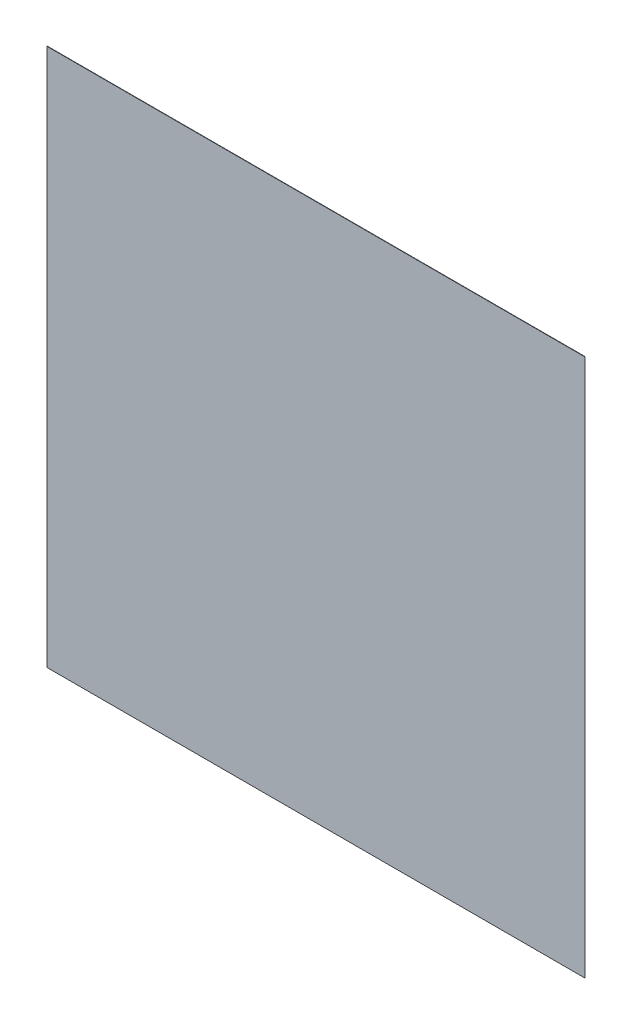
ISO-10303-21;
HEADER;
FILE_DESCRIPTION(('STEP AP214'),'2;1');
FILE_NAME('part.step','',(''),(''),'','','');
FILE_SCHEMA(('AUTOMOTIVE_DESIGN { 1 0 10303 214 1 1 1 1 }'));
ENDSEC;
DATA;
#1=APPLICATION_CONTEXT('core data for automotive mechanical design processes');
#2=APPLICATION_PROTOCOL_DEFINITION('international standard','automotive_design',2000,#1);
#3=PRODUCT_CONTEXT('',#1,'mechanical');
#4=PRODUCT('Part','Part','',(#3));
#5=PRODUCT_RELATED_PRODUCT_CATEGORY('part','',(#4));
#6=PRODUCT_DEFINITION_FORMATION('','',#4);
#7=PRODUCT_DEFINITION_CONTEXT('part definition',#1,'design');
#8=PRODUCT_DEFINITION('design','',#6,#7);
#9=PRODUCT_DEFINITION_SHAPE('','',#8);
#10=(LENGTH_UNIT() NAMED_UNIT(*) SI_UNIT(.MILLI.,.METRE.));
#11=(NAMED_UNIT(*) PLANE_ANGLE_UNIT() SI_UNIT($,.RADIAN.));
#12=(NAMED_UNIT(*) SI_UNIT($,.STERADIAN.) SOLID_ANGLE_UNIT());
#13=UNCERTAINTY_MEASURE_WITH_UNIT(LENGTH_MEASURE(1.E-05),#10,'distance_accuracy_value','');
#14=(GEOMETRIC_REPRESENTATION_CONTEXT(3) GLOBAL_UNCERTAINTY_ASSIGNED_CONTEXT((#13)) GLOBAL_UNIT_ASSIGNED_CONTEXT((#10,
#11,#12)) REPRESENTATION_CONTEXT('',''));
#15=CARTESIAN_POINT('',(0.,0.,0.));
#16=DIRECTION('',(0.,0.,1.));
#17=DIRECTION('',(1.,0.,0.));
#18=AXIS2_PLACEMENT_3D('',#15,#16,#17);
#19=CARTESIAN_POINT('',(15.,-15.,0.02));
#20=DIRECTION('',(-1.,0.,0.));
#21=DIRECTION('',(0.,0.,1.));
#22=AXIS2_PLACEMENT_3D('',#19,#20,#21);
#23=PLANE('',#22);
#24=DIRECTION('',(0.,1.,0.));
#25=VECTOR('',#24,1.);
#26=CARTESIAN_POINT('',(15.,-15.,0.));
#27=LINE('',#26,#25);
#28=CARTESIAN_POINT('',(15.,-15.,0.));
#29=VERTEX_POINT('',#28);
#30=CARTESIAN_POINT('',(15.,15.,0.));
#31=VERTEX_POINT('',#30);
#32=EDGE_CURVE('E96',#29,#31,#27,.T.);
#33=ORIENTED_EDGE('',*,*,#32,.T.);
#34=DIRECTION('',(0.,0.,-1.));
#35=VECTOR('',#34,1.);
#36=CARTESIAN_POINT('',(15.,15.,0.02));
#37=LINE('',#36,#35);
#38=CARTESIAN_POINT('',(15.,15.,0.02));
#39=VERTEX_POINT('',#38);
#40=EDGE_CURVE('E11',#39,#31,#37,.T.);
#41=ORIENTED_EDGE('',*,*,#40,.F.);
#42=DIRECTION('',(0.,1.,0.));
#43=VECTOR('',#42,1.);
#44=CARTESIAN_POINT('',(15.,-15.,0.02));
#45=LINE('',#44,#43);
#46=CARTESIAN_POINT('',(15.,-15.,0.02));
#47=VERTEX_POINT('',#46);
#48=EDGE_CURVE('E84',#47,#39,#45,.T.);
#49=ORIENTED_EDGE('',*,*,#48,.F.);
#50=DIRECTION('',(0.,0.,-1.));
#51=VECTOR('',#50,1.);
#52=CARTESIAN_POINT('',(15.,-15.,0.02));
#53=LINE('',#52,#51);
#54=EDGE_CURVE('E92',#47,#29,#53,.T.);
#55=ORIENTED_EDGE('',*,*,#54,.T.);
#56=EDGE_LOOP('',(#33,#41,#49,#55));
#57=FACE_BOUND('',#56,.T.);
#58=ADVANCED_FACE('F33',(#57),#23,.F.);
#59=CARTESIAN_POINT('',(-15.,15.,0.02));
#60=DIRECTION('',(0.,-1.,0.));
#61=DIRECTION('',(0.,0.,-1.));
#62=AXIS2_PLACEMENT_3D('',#59,#60,#61);
#63=PLANE('',#62);
#64=DIRECTION('',(-1.,0.,0.));
#65=VECTOR('',#64,1.);
#66=CARTESIAN_POINT('',(-15.,15.,0.));
#67=LINE('',#66,#65);
#68=CARTESIAN_POINT('',(-15.,15.,0.));
#69=VERTEX_POINT('',#68);
#70=EDGE_CURVE('E88',#31,#69,#67,.T.);
#71=ORIENTED_EDGE('',*,*,#70,.T.);
#72=DIRECTION('',(0.,0.,-1.));
#73=VECTOR('',#72,1.);
#74=CARTESIAN_POINT('',(-15.,15.,0.02));
#75=LINE('',#74,#73);
#76=CARTESIAN_POINT('',(-15.,15.,0.02));
#77=VERTEX_POINT('',#76);
#78=EDGE_CURVE('E41',#77,#69,#75,.T.);
#79=ORIENTED_EDGE('',*,*,#78,.F.);
#80=DIRECTION('',(-1.,0.,0.));
#81=VECTOR('',#80,1.);
#82=CARTESIAN_POINT('',(-15.,15.,0.02));
#83=LINE('',#82,#81);
#84=EDGE_CURVE('E79',#39,#77,#83,.T.);
#85=ORIENTED_EDGE('',*,*,#84,.F.);
#86=ORIENTED_EDGE('',*,*,#40,.T.);
#87=EDGE_LOOP('',(#71,#79,#85,#86));
#88=FACE_BOUND('',#87,.T.);
#89=ADVANCED_FACE('F87',(#88),#63,.F.);
#90=CARTESIAN_POINT('',(-15.,-15.,0.02));
#91=DIRECTION('',(1.,0.,0.));
#92=DIRECTION('',(0.,0.,-1.));
#93=AXIS2_PLACEMENT_3D('',#90,#91,#92);
#94=PLANE('',#93);
#95=DIRECTION('',(0.,-1.,0.));
#96=VECTOR('',#95,1.);
#97=CARTESIAN_POINT('',(-15.,-15.,0.));
#98=LINE('',#97,#96);
#99=CARTESIAN_POINT('',(-15.,-15.,0.));
#100=VERTEX_POINT('',#99);
#101=EDGE_CURVE('E66',#69,#100,#98,.T.);
#102=ORIENTED_EDGE('',*,*,#101,.T.);
#103=DIRECTION('',(0.,0.,-1.));
#104=VECTOR('',#103,1.);
#105=CARTESIAN_POINT('',(-15.,-15.,0.02));
#106=LINE('',#105,#104);
#107=CARTESIAN_POINT('',(-15.,-15.,0.02));
#108=VERTEX_POINT('',#107);
#109=EDGE_CURVE('E89',#108,#100,#106,.T.);
#110=ORIENTED_EDGE('',*,*,#109,.F.);
#111=DIRECTION('',(0.,-1.,0.));
#112=VECTOR('',#111,1.);
#113=CARTESIAN_POINT('',(-15.,-15.,0.02));
#114=LINE('',#113,#112);
#115=EDGE_CURVE('E82',#77,#108,#114,.T.);
#116=ORIENTED_EDGE('',*,*,#115,.F.);
#117=ORIENTED_EDGE('',*,*,#78,.T.);
#118=EDGE_LOOP('',(#102,#110,#116,#117));
#119=FACE_BOUND('',#118,.T.);
#120=ADVANCED_FACE('F90',(#119),#94,.F.);
#121=CARTESIAN_POINT('',(-15.,-15.,0.02));
#122=DIRECTION('',(0.,1.,0.));
#123=DIRECTION('',(0.,0.,1.));
#124=AXIS2_PLACEMENT_3D('',#121,#122,#123);
#125=PLANE('',#124);
#126=DIRECTION('',(1.,0.,0.));
#127=VECTOR('',#126,1.);
#128=CARTESIAN_POINT('',(-15.,-15.,0.));
#129=LINE('',#128,#127);
#130=EDGE_CURVE('E72',#100,#29,#129,.T.);
#131=ORIENTED_EDGE('',*,*,#130,.T.);
#132=ORIENTED_EDGE('',*,*,#54,.F.);
#133=DIRECTION('',(1.,0.,0.));
#134=VECTOR('',#133,1.);
#135=CARTESIAN_POINT('',(-15.,-15.,0.02));
#136=LINE('',#135,#134);
#137=EDGE_CURVE('E49',#108,#47,#136,.T.);
#138=ORIENTED_EDGE('',*,*,#137,.F.);
#139=ORIENTED_EDGE('',*,*,#109,.T.);
#140=EDGE_LOOP('',(#131,#132,#138,#139));
#141=FACE_BOUND('',#140,.T.);
#142=ADVANCED_FACE('F103',(#141),#125,.F.);
#143=CARTESIAN_POINT('',(0.,0.,0.02));
#144=DIRECTION('',(0.,0.,-1.));
#145=DIRECTION('',(-1.,0.,0.));
#146=AXIS2_PLACEMENT_3D('',#143,#144,#145);
#147=PLANE('',#146);
#148=ORIENTED_EDGE('',*,*,#48,.T.);
#149=ORIENTED_EDGE('',*,*,#84,.T.);
#150=ORIENTED_EDGE('',*,*,#115,.T.);
#151=ORIENTED_EDGE('',*,*,#137,.T.);
#152=EDGE_LOOP('',(#148,#149,#150,#151));
#153=FACE_BOUND('',#152,.T.);
#154=ADVANCED_FACE('F80',(#153),#147,.F.);
#155=CARTESIAN_POINT('',(0.,0.,0.));
#156=DIRECTION('',(0.,0.,-1.));
#157=DIRECTION('',(-1.,0.,0.));
#158=AXIS2_PLACEMENT_3D('',#155,#156,#157);
#159=PLANE('',#158);
#160=ORIENTED_EDGE('',*,*,#32,.F.);
#161=ORIENTED_EDGE('',*,*,#130,.F.);
#162=ORIENTED_EDGE('',*,*,#101,.F.);
#163=ORIENTED_EDGE('',*,*,#70,.F.);
#164=EDGE_LOOP('',(#160,#161,#162,#163));
#165=FACE_BOUND('',#164,.T.);
#166=ADVANCED_FACE('F106',(#165),#159,.T.);
#167=CLOSED_SHELL('',(#58,#89,#120,#142,#154,#166));
#168=MANIFOLD_SOLID_BREP('B2',#167);
#169=ADVANCED_BREP_SHAPE_REPRESENTATION('',(#18,#168),#14);
#170=SHAPE_DEFINITION_REPRESENTATION(#9,#169);
ENDSEC;
END-ISO-10303-21;
